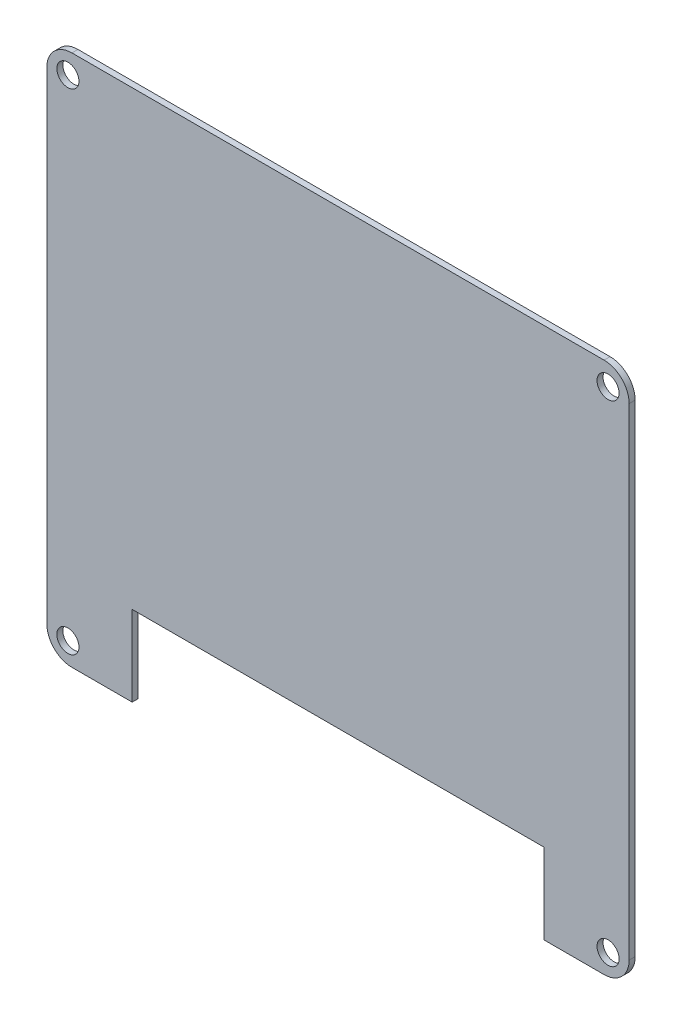
ISO-10303-21;
HEADER;
FILE_DESCRIPTION(('STEP AP214'),'2;1');
FILE_NAME('part.step','',(''),(''),'','','');
FILE_SCHEMA(('AUTOMOTIVE_DESIGN { 1 0 10303 214 1 1 1 1 }'));
ENDSEC;
DATA;
#1=APPLICATION_CONTEXT('core data for automotive mechanical design processes');
#2=APPLICATION_PROTOCOL_DEFINITION('international standard','automotive_design',2000,#1);
#3=PRODUCT_CONTEXT('',#1,'mechanical');
#4=PRODUCT('Part','Part','',(#3));
#5=PRODUCT_RELATED_PRODUCT_CATEGORY('part','',(#4));
#6=PRODUCT_DEFINITION_FORMATION('','',#4);
#7=PRODUCT_DEFINITION_CONTEXT('part definition',#1,'design');
#8=PRODUCT_DEFINITION('design','',#6,#7);
#9=PRODUCT_DEFINITION_SHAPE('','',#8);
#10=(LENGTH_UNIT() NAMED_UNIT(*) SI_UNIT(.MILLI.,.METRE.));
#11=(NAMED_UNIT(*) PLANE_ANGLE_UNIT() SI_UNIT($,.RADIAN.));
#12=(NAMED_UNIT(*) SI_UNIT($,.STERADIAN.) SOLID_ANGLE_UNIT());
#13=UNCERTAINTY_MEASURE_WITH_UNIT(LENGTH_MEASURE(1.E-05),#10,'distance_accuracy_value','');
#14=(GEOMETRIC_REPRESENTATION_CONTEXT(3) GLOBAL_UNCERTAINTY_ASSIGNED_CONTEXT((#13)) GLOBAL_UNIT_ASSIGNED_CONTEXT((#10,
#11,#12)) REPRESENTATION_CONTEXT('',''));
#15=CARTESIAN_POINT('',(0.,0.,0.));
#16=DIRECTION('',(0.,0.,1.));
#17=DIRECTION('',(1.,0.,0.));
#18=AXIS2_PLACEMENT_3D('',#15,#16,#17);
#19=CARTESIAN_POINT('',(-26.5,-24.,0.6));
#20=DIRECTION('',(0.,0.,-1.));
#21=DIRECTION('',(-1.,0.,0.));
#22=AXIS2_PLACEMENT_3D('',#19,#20,#21);
#23=PLANE('',#22);
#24=CARTESIAN_POINT('',(-26.5,-24.,0.6));
#25=DIRECTION('',(0.,0.,1.));
#26=DIRECTION('',(-1.,0.,0.));
#27=AXIS2_PLACEMENT_3D('',#24,#25,#26);
#28=CIRCLE('',#27,2.5);
#29=CARTESIAN_POINT('',(-29.,-24.,0.6));
#30=VERTEX_POINT('',#29);
#31=CARTESIAN_POINT('',(-26.5,-26.5,0.6));
#32=VERTEX_POINT('',#31);
#33=EDGE_CURVE('E179',#30,#32,#28,.T.);
#34=ORIENTED_EDGE('',*,*,#33,.T.);
#35=DIRECTION('',(1.,0.,0.));
#36=VECTOR('',#35,1.);
#37=CARTESIAN_POINT('',(-26.5,-26.5,0.6));
#38=LINE('',#37,#36);
#39=CARTESIAN_POINT('',(-20.5,-26.5,0.6));
#40=VERTEX_POINT('',#39);
#41=EDGE_CURVE('E107',#32,#40,#38,.T.);
#42=ORIENTED_EDGE('',*,*,#41,.T.);
#43=DIRECTION('',(0.,1.,0.));
#44=VECTOR('',#43,1.);
#45=CARTESIAN_POINT('',(-20.5,-26.5,0.6));
#46=LINE('',#45,#44);
#47=CARTESIAN_POINT('',(-20.5,-18.5,0.6));
#48=VERTEX_POINT('',#47);
#49=EDGE_CURVE('E206',#40,#48,#46,.T.);
#50=ORIENTED_EDGE('',*,*,#49,.T.);
#51=DIRECTION('',(1.,0.,0.));
#52=VECTOR('',#51,1.);
#53=CARTESIAN_POINT('',(-20.5,-18.5,0.6));
#54=LINE('',#53,#52);
#55=CARTESIAN_POINT('',(20.5,-18.5,0.6));
#56=VERTEX_POINT('',#55);
#57=EDGE_CURVE('E225',#48,#56,#54,.T.);
#58=ORIENTED_EDGE('',*,*,#57,.T.);
#59=DIRECTION('',(0.,-1.,0.));
#60=VECTOR('',#59,1.);
#61=CARTESIAN_POINT('',(20.5,-18.5,0.6));
#62=LINE('',#61,#60);
#63=CARTESIAN_POINT('',(20.5,-26.5,0.6));
#64=VERTEX_POINT('',#63);
#65=EDGE_CURVE('E222',#56,#64,#62,.T.);
#66=ORIENTED_EDGE('',*,*,#65,.T.);
#67=DIRECTION('',(1.,0.,0.));
#68=VECTOR('',#67,1.);
#69=CARTESIAN_POINT('',(20.5,-26.5,0.6));
#70=LINE('',#69,#68);
#71=CARTESIAN_POINT('',(26.5,-26.5,0.6));
#72=VERTEX_POINT('',#71);
#73=EDGE_CURVE('E224',#64,#72,#70,.T.);
#74=ORIENTED_EDGE('',*,*,#73,.T.);
#75=CARTESIAN_POINT('',(26.5,-24.,0.6));
#76=DIRECTION('',(0.,0.,1.));
#77=DIRECTION('',(1.,0.,0.));
#78=AXIS2_PLACEMENT_3D('',#75,#76,#77);
#79=CIRCLE('',#78,2.5);
#80=CARTESIAN_POINT('',(29.,-24.,0.6));
#81=VERTEX_POINT('',#80);
#82=EDGE_CURVE('E227',#72,#81,#79,.T.);
#83=ORIENTED_EDGE('',*,*,#82,.T.);
#84=DIRECTION('',(0.,1.,0.));
#85=VECTOR('',#84,1.);
#86=CARTESIAN_POINT('',(29.,-24.,0.6));
#87=LINE('',#86,#85);
#88=CARTESIAN_POINT('',(29.,24.,0.6));
#89=VERTEX_POINT('',#88);
#90=EDGE_CURVE('E233',#81,#89,#87,.T.);
#91=ORIENTED_EDGE('',*,*,#90,.T.);
#92=CARTESIAN_POINT('',(26.5,24.,0.6));
#93=DIRECTION('',(0.,0.,1.));
#94=DIRECTION('',(-1.,0.,0.));
#95=AXIS2_PLACEMENT_3D('',#92,#93,#94);
#96=CIRCLE('',#95,2.5);
#97=CARTESIAN_POINT('',(26.5,26.5,0.6));
#98=VERTEX_POINT('',#97);
#99=EDGE_CURVE('E138',#89,#98,#96,.T.);
#100=ORIENTED_EDGE('',*,*,#99,.T.);
#101=DIRECTION('',(-1.,0.,0.));
#102=VECTOR('',#101,1.);
#103=CARTESIAN_POINT('',(-26.5,26.5,0.6));
#104=LINE('',#103,#102);
#105=CARTESIAN_POINT('',(-26.5,26.5,0.6));
#106=VERTEX_POINT('',#105);
#107=EDGE_CURVE('E132',#98,#106,#104,.T.);
#108=ORIENTED_EDGE('',*,*,#107,.T.);
#109=CARTESIAN_POINT('',(-26.5,24.,0.6));
#110=DIRECTION('',(0.,0.,1.));
#111=DIRECTION('',(-1.,0.,0.));
#112=AXIS2_PLACEMENT_3D('',#109,#110,#111);
#113=CIRCLE('',#112,2.5);
#114=CARTESIAN_POINT('',(-29.,24.,0.6));
#115=VERTEX_POINT('',#114);
#116=EDGE_CURVE('E136',#106,#115,#113,.T.);
#117=ORIENTED_EDGE('',*,*,#116,.T.);
#118=DIRECTION('',(0.,-1.,0.));
#119=VECTOR('',#118,1.);
#120=CARTESIAN_POINT('',(-29.,-24.,0.6));
#121=LINE('',#120,#119);
#122=EDGE_CURVE('E52',#115,#30,#121,.T.);
#123=ORIENTED_EDGE('',*,*,#122,.T.);
#124=EDGE_LOOP('',(#34,#42,#50,#58,#66,#74,#83,#91,#100,#108,#117,#123));
#125=FACE_BOUND('',#124,.T.);
#126=CARTESIAN_POINT('',(-26.9,24.4,0.6));
#127=DIRECTION('',(0.,0.,1.));
#128=DIRECTION('',(1.,0.,0.));
#129=AXIS2_PLACEMENT_3D('',#126,#127,#128);
#130=CIRCLE('',#129,1.1);
#131=CARTESIAN_POINT('',(-25.8,24.4,0.6));
#132=VERTEX_POINT('',#131);
#133=EDGE_CURVE('E160',#132,#132,#130,.T.);
#134=ORIENTED_EDGE('',*,*,#133,.F.);
#135=EDGE_LOOP('',(#134));
#136=FACE_BOUND('',#135,.T.);
#137=CARTESIAN_POINT('',(-26.9,-24.4,0.6));
#138=DIRECTION('',(0.,0.,1.));
#139=DIRECTION('',(-1.,0.,0.));
#140=AXIS2_PLACEMENT_3D('',#137,#138,#139);
#141=CIRCLE('',#140,1.1);
#142=CARTESIAN_POINT('',(-28.,-24.4,0.6));
#143=VERTEX_POINT('',#142);
#144=EDGE_CURVE('E297',#143,#143,#141,.T.);
#145=ORIENTED_EDGE('',*,*,#144,.F.);
#146=EDGE_LOOP('',(#145));
#147=FACE_BOUND('',#146,.T.);
#148=CARTESIAN_POINT('',(26.9,-24.4,0.6));
#149=DIRECTION('',(0.,0.,1.));
#150=DIRECTION('',(1.,0.,0.));
#151=AXIS2_PLACEMENT_3D('',#148,#149,#150);
#152=CIRCLE('',#151,1.09999999999999);
#153=CARTESIAN_POINT('',(28.,-24.4,0.6));
#154=VERTEX_POINT('',#153);
#155=EDGE_CURVE('E291',#154,#154,#152,.T.);
#156=ORIENTED_EDGE('',*,*,#155,.F.);
#157=EDGE_LOOP('',(#156));
#158=FACE_BOUND('',#157,.T.);
#159=CARTESIAN_POINT('',(26.9,24.4,0.6));
#160=DIRECTION('',(0.,0.,1.));
#161=DIRECTION('',(-1.,0.,0.));
#162=AXIS2_PLACEMENT_3D('',#159,#160,#161);
#163=CIRCLE('',#162,1.1);
#164=CARTESIAN_POINT('',(25.8,24.4,0.6));
#165=VERTEX_POINT('',#164);
#166=EDGE_CURVE('E282',#165,#165,#163,.T.);
#167=ORIENTED_EDGE('',*,*,#166,.F.);
#168=EDGE_LOOP('',(#167));
#169=FACE_BOUND('',#168,.T.);
#170=ADVANCED_FACE('F35',(#125,#136,#147,#158,#169),#23,.F.);
#171=CARTESIAN_POINT('',(-26.5,-24.,0.));
#172=DIRECTION('',(0.,0.,-1.));
#173=DIRECTION('',(-1.,0.,0.));
#174=AXIS2_PLACEMENT_3D('',#171,#172,#173);
#175=PLANE('',#174);
#176=CARTESIAN_POINT('',(26.9,-24.4,0.));
#177=DIRECTION('',(0.,0.,1.));
#178=DIRECTION('',(1.,0.,0.));
#179=AXIS2_PLACEMENT_3D('',#176,#177,#178);
#180=CIRCLE('',#179,1.09999999999999);
#181=CARTESIAN_POINT('',(28.,-24.4,0.));
#182=VERTEX_POINT('',#181);
#183=EDGE_CURVE('E288',#182,#182,#180,.T.);
#184=ORIENTED_EDGE('',*,*,#183,.T.);
#185=EDGE_LOOP('',(#184));
#186=FACE_BOUND('',#185,.T.);
#187=CARTESIAN_POINT('',(-26.9,24.4,0.));
#188=DIRECTION('',(0.,0.,1.));
#189=DIRECTION('',(1.,0.,0.));
#190=AXIS2_PLACEMENT_3D('',#187,#188,#189);
#191=CIRCLE('',#190,1.1);
#192=CARTESIAN_POINT('',(-25.8,24.4,0.));
#193=VERTEX_POINT('',#192);
#194=EDGE_CURVE('E300',#193,#193,#191,.T.);
#195=ORIENTED_EDGE('',*,*,#194,.T.);
#196=EDGE_LOOP('',(#195));
#197=FACE_BOUND('',#196,.T.);
#198=CARTESIAN_POINT('',(-26.5,-24.,0.));
#199=DIRECTION('',(0.,0.,1.));
#200=DIRECTION('',(-1.,0.,0.));
#201=AXIS2_PLACEMENT_3D('',#198,#199,#200);
#202=CIRCLE('',#201,2.5);
#203=CARTESIAN_POINT('',(-29.,-24.,0.));
#204=VERTEX_POINT('',#203);
#205=CARTESIAN_POINT('',(-26.5,-26.5,0.));
#206=VERTEX_POINT('',#205);
#207=EDGE_CURVE('E156',#204,#206,#202,.T.);
#208=ORIENTED_EDGE('',*,*,#207,.F.);
#209=DIRECTION('',(0.,-1.,0.));
#210=VECTOR('',#209,1.);
#211=CARTESIAN_POINT('',(-29.,-24.,0.));
#212=LINE('',#211,#210);
#213=CARTESIAN_POINT('',(-29.,24.,0.));
#214=VERTEX_POINT('',#213);
#215=EDGE_CURVE('E99',#214,#204,#212,.T.);
#216=ORIENTED_EDGE('',*,*,#215,.F.);
#217=CARTESIAN_POINT('',(-26.5,24.,0.));
#218=DIRECTION('',(0.,0.,1.));
#219=DIRECTION('',(-1.,0.,0.));
#220=AXIS2_PLACEMENT_3D('',#217,#218,#219);
#221=CIRCLE('',#220,2.5);
#222=CARTESIAN_POINT('',(-26.5,26.5,0.));
#223=VERTEX_POINT('',#222);
#224=EDGE_CURVE('E93',#223,#214,#221,.T.);
#225=ORIENTED_EDGE('',*,*,#224,.F.);
#226=DIRECTION('',(-1.,0.,0.));
#227=VECTOR('',#226,1.);
#228=CARTESIAN_POINT('',(-26.5,26.5,0.));
#229=LINE('',#228,#227);
#230=CARTESIAN_POINT('',(26.5,26.5,0.));
#231=VERTEX_POINT('',#230);
#232=EDGE_CURVE('E146',#231,#223,#229,.T.);
#233=ORIENTED_EDGE('',*,*,#232,.F.);
#234=CARTESIAN_POINT('',(26.5,24.,0.));
#235=DIRECTION('',(0.,0.,1.));
#236=DIRECTION('',(-1.,0.,0.));
#237=AXIS2_PLACEMENT_3D('',#234,#235,#236);
#238=CIRCLE('',#237,2.5);
#239=CARTESIAN_POINT('',(29.,24.,0.));
#240=VERTEX_POINT('',#239);
#241=EDGE_CURVE('E174',#240,#231,#238,.T.);
#242=ORIENTED_EDGE('',*,*,#241,.F.);
#243=DIRECTION('',(0.,1.,0.));
#244=VECTOR('',#243,1.);
#245=CARTESIAN_POINT('',(29.,-24.,0.));
#246=LINE('',#245,#244);
#247=CARTESIAN_POINT('',(29.,-24.,0.));
#248=VERTEX_POINT('',#247);
#249=EDGE_CURVE('E172',#248,#240,#246,.T.);
#250=ORIENTED_EDGE('',*,*,#249,.F.);
#251=CARTESIAN_POINT('',(26.5,-24.,0.));
#252=DIRECTION('',(0.,0.,1.));
#253=DIRECTION('',(1.,0.,0.));
#254=AXIS2_PLACEMENT_3D('',#251,#252,#253);
#255=CIRCLE('',#254,2.5);
#256=CARTESIAN_POINT('',(26.5,-26.5,0.));
#257=VERTEX_POINT('',#256);
#258=EDGE_CURVE('E170',#257,#248,#255,.T.);
#259=ORIENTED_EDGE('',*,*,#258,.F.);
#260=DIRECTION('',(1.,0.,0.));
#261=VECTOR('',#260,1.);
#262=CARTESIAN_POINT('',(20.5,-26.5,0.));
#263=LINE('',#262,#261);
#264=CARTESIAN_POINT('',(20.5,-26.5,0.));
#265=VERTEX_POINT('',#264);
#266=EDGE_CURVE('E168',#265,#257,#263,.T.);
#267=ORIENTED_EDGE('',*,*,#266,.F.);
#268=DIRECTION('',(0.,-1.,0.));
#269=VECTOR('',#268,1.);
#270=CARTESIAN_POINT('',(20.5,-18.5,0.));
#271=LINE('',#270,#269);
#272=CARTESIAN_POINT('',(20.5,-18.5,0.));
#273=VERTEX_POINT('',#272);
#274=EDGE_CURVE('E166',#273,#265,#271,.T.);
#275=ORIENTED_EDGE('',*,*,#274,.F.);
#276=DIRECTION('',(1.,0.,0.));
#277=VECTOR('',#276,1.);
#278=CARTESIAN_POINT('',(-20.5,-18.5,0.));
#279=LINE('',#278,#277);
#280=CARTESIAN_POINT('',(-20.5,-18.5,0.));
#281=VERTEX_POINT('',#280);
#282=EDGE_CURVE('E164',#281,#273,#279,.T.);
#283=ORIENTED_EDGE('',*,*,#282,.F.);
#284=DIRECTION('',(0.,1.,0.));
#285=VECTOR('',#284,1.);
#286=CARTESIAN_POINT('',(-20.5,-26.5,0.));
#287=LINE('',#286,#285);
#288=CARTESIAN_POINT('',(-20.5,-26.5,0.));
#289=VERTEX_POINT('',#288);
#290=EDGE_CURVE('E162',#289,#281,#287,.T.);
#291=ORIENTED_EDGE('',*,*,#290,.F.);
#292=DIRECTION('',(1.,0.,0.));
#293=VECTOR('',#292,1.);
#294=CARTESIAN_POINT('',(-26.5,-26.5,0.));
#295=LINE('',#294,#293);
#296=EDGE_CURVE('E159',#206,#289,#295,.T.);
#297=ORIENTED_EDGE('',*,*,#296,.F.);
#298=EDGE_LOOP('',(#208,#216,#225,#233,#242,#250,#259,#267,#275,#283,#291,#297));
#299=FACE_BOUND('',#298,.T.);
#300=CARTESIAN_POINT('',(-26.9,-24.4,0.));
#301=DIRECTION('',(0.,0.,1.));
#302=DIRECTION('',(-1.,0.,0.));
#303=AXIS2_PLACEMENT_3D('',#300,#301,#302);
#304=CIRCLE('',#303,1.1);
#305=CARTESIAN_POINT('',(-28.,-24.4,0.));
#306=VERTEX_POINT('',#305);
#307=EDGE_CURVE('E294',#306,#306,#304,.T.);
#308=ORIENTED_EDGE('',*,*,#307,.T.);
#309=EDGE_LOOP('',(#308));
#310=FACE_BOUND('',#309,.T.);
#311=CARTESIAN_POINT('',(26.9,24.4,0.));
#312=DIRECTION('',(0.,0.,1.));
#313=DIRECTION('',(-1.,0.,0.));
#314=AXIS2_PLACEMENT_3D('',#311,#312,#313);
#315=CIRCLE('',#314,1.1);
#316=CARTESIAN_POINT('',(25.8,24.4,0.));
#317=VERTEX_POINT('',#316);
#318=EDGE_CURVE('E285',#317,#317,#315,.T.);
#319=ORIENTED_EDGE('',*,*,#318,.T.);
#320=EDGE_LOOP('',(#319));
#321=FACE_BOUND('',#320,.T.);
#322=ADVANCED_FACE('F210',(#186,#197,#299,#310,#321),#175,.T.);
#323=CARTESIAN_POINT('',(-26.5,-24.,0.6));
#324=DIRECTION('',(0.,0.,-1.));
#325=DIRECTION('',(-1.,0.,0.));
#326=AXIS2_PLACEMENT_3D('',#323,#324,#325);
#327=CYLINDRICAL_SURFACE('',#326,2.5);
#328=ORIENTED_EDGE('',*,*,#207,.T.);
#329=DIRECTION('',(0.,0.,-1.));
#330=VECTOR('',#329,1.);
#331=CARTESIAN_POINT('',(-26.5,-26.5,0.6));
#332=LINE('',#331,#330);
#333=EDGE_CURVE('E11',#32,#206,#332,.T.);
#334=ORIENTED_EDGE('',*,*,#333,.F.);
#335=ORIENTED_EDGE('',*,*,#33,.F.);
#336=DIRECTION('',(0.,0.,-1.));
#337=VECTOR('',#336,1.);
#338=CARTESIAN_POINT('',(-29.,-24.,0.6));
#339=LINE('',#338,#337);
#340=EDGE_CURVE('E152',#30,#204,#339,.T.);
#341=ORIENTED_EDGE('',*,*,#340,.T.);
#342=EDGE_LOOP('',(#328,#334,#335,#341));
#343=FACE_BOUND('',#342,.T.);
#344=ADVANCED_FACE('F37',(#343),#327,.T.);
#345=CARTESIAN_POINT('',(-26.5,-26.5,0.6));
#346=DIRECTION('',(0.,1.,0.));
#347=DIRECTION('',(0.,0.,1.));
#348=AXIS2_PLACEMENT_3D('',#345,#346,#347);
#349=PLANE('',#348);
#350=ORIENTED_EDGE('',*,*,#296,.T.);
#351=DIRECTION('',(0.,0.,-1.));
#352=VECTOR('',#351,1.);
#353=CARTESIAN_POINT('',(-20.5,-26.5,0.6));
#354=LINE('',#353,#352);
#355=EDGE_CURVE('E44',#40,#289,#354,.T.);
#356=ORIENTED_EDGE('',*,*,#355,.F.);
#357=ORIENTED_EDGE('',*,*,#41,.F.);
#358=ORIENTED_EDGE('',*,*,#333,.T.);
#359=EDGE_LOOP('',(#350,#356,#357,#358));
#360=FACE_BOUND('',#359,.T.);
#361=ADVANCED_FACE('F412',(#360),#349,.F.);
#362=CARTESIAN_POINT('',(-20.5,-26.5,0.6));
#363=DIRECTION('',(-1.,0.,0.));
#364=DIRECTION('',(0.,0.,1.));
#365=AXIS2_PLACEMENT_3D('',#362,#363,#364);
#366=PLANE('',#365);
#367=ORIENTED_EDGE('',*,*,#290,.T.);
#368=DIRECTION('',(0.,0.,-1.));
#369=VECTOR('',#368,1.);
#370=CARTESIAN_POINT('',(-20.5,-18.5,0.6));
#371=LINE('',#370,#369);
#372=EDGE_CURVE('E198',#48,#281,#371,.T.);
#373=ORIENTED_EDGE('',*,*,#372,.F.);
#374=ORIENTED_EDGE('',*,*,#49,.F.);
#375=ORIENTED_EDGE('',*,*,#355,.T.);
#376=EDGE_LOOP('',(#367,#373,#374,#375));
#377=FACE_BOUND('',#376,.T.);
#378=ADVANCED_FACE('F204',(#377),#366,.F.);
#379=CARTESIAN_POINT('',(-20.5,-18.5,0.6));
#380=DIRECTION('',(0.,1.,0.));
#381=DIRECTION('',(0.,0.,1.));
#382=AXIS2_PLACEMENT_3D('',#379,#380,#381);
#383=PLANE('',#382);
#384=ORIENTED_EDGE('',*,*,#282,.T.);
#385=DIRECTION('',(0.,0.,-1.));
#386=VECTOR('',#385,1.);
#387=CARTESIAN_POINT('',(20.5,-18.5,0.6));
#388=LINE('',#387,#386);
#389=EDGE_CURVE('E195',#56,#273,#388,.T.);
#390=ORIENTED_EDGE('',*,*,#389,.F.);
#391=ORIENTED_EDGE('',*,*,#57,.F.);
#392=ORIENTED_EDGE('',*,*,#372,.T.);
#393=EDGE_LOOP('',(#384,#390,#391,#392));
#394=FACE_BOUND('',#393,.T.);
#395=ADVANCED_FACE('F216',(#394),#383,.F.);
#396=CARTESIAN_POINT('',(20.5,-18.5,0.6));
#397=DIRECTION('',(1.,0.,0.));
#398=DIRECTION('',(0.,0.,-1.));
#399=AXIS2_PLACEMENT_3D('',#396,#397,#398);
#400=PLANE('',#399);
#401=ORIENTED_EDGE('',*,*,#274,.T.);
#402=DIRECTION('',(0.,0.,-1.));
#403=VECTOR('',#402,1.);
#404=CARTESIAN_POINT('',(20.5,-26.5,0.6));
#405=LINE('',#404,#403);
#406=EDGE_CURVE('E192',#64,#265,#405,.T.);
#407=ORIENTED_EDGE('',*,*,#406,.F.);
#408=ORIENTED_EDGE('',*,*,#65,.F.);
#409=ORIENTED_EDGE('',*,*,#389,.T.);
#410=EDGE_LOOP('',(#401,#407,#408,#409));
#411=FACE_BOUND('',#410,.T.);
#412=ADVANCED_FACE('F220',(#411),#400,.F.);
#413=CARTESIAN_POINT('',(20.5,-26.5,0.6));
#414=DIRECTION('',(0.,1.,0.));
#415=DIRECTION('',(0.,0.,1.));
#416=AXIS2_PLACEMENT_3D('',#413,#414,#415);
#417=PLANE('',#416);
#418=ORIENTED_EDGE('',*,*,#266,.T.);
#419=DIRECTION('',(0.,0.,-1.));
#420=VECTOR('',#419,1.);
#421=CARTESIAN_POINT('',(26.5,-26.5,0.6));
#422=LINE('',#421,#420);
#423=EDGE_CURVE('E189',#72,#257,#422,.T.);
#424=ORIENTED_EDGE('',*,*,#423,.F.);
#425=ORIENTED_EDGE('',*,*,#73,.F.);
#426=ORIENTED_EDGE('',*,*,#406,.T.);
#427=EDGE_LOOP('',(#418,#424,#425,#426));
#428=FACE_BOUND('',#427,.T.);
#429=ADVANCED_FACE('F377',(#428),#417,.F.);
#430=CARTESIAN_POINT('',(26.5,-24.,0.6));
#431=DIRECTION('',(0.,0.,-1.));
#432=DIRECTION('',(-1.,0.,0.));
#433=AXIS2_PLACEMENT_3D('',#430,#431,#432);
#434=CYLINDRICAL_SURFACE('',#433,2.5);
#435=ORIENTED_EDGE('',*,*,#258,.T.);
#436=DIRECTION('',(0.,0.,-1.));
#437=VECTOR('',#436,1.);
#438=CARTESIAN_POINT('',(29.,-24.,0.6));
#439=LINE('',#438,#437);
#440=EDGE_CURVE('E186',#81,#248,#439,.T.);
#441=ORIENTED_EDGE('',*,*,#440,.F.);
#442=ORIENTED_EDGE('',*,*,#82,.F.);
#443=ORIENTED_EDGE('',*,*,#423,.T.);
#444=EDGE_LOOP('',(#435,#441,#442,#443));
#445=FACE_BOUND('',#444,.T.);
#446=ADVANCED_FACE('F368',(#445),#434,.T.);
#447=CARTESIAN_POINT('',(29.,-24.,0.6));
#448=DIRECTION('',(-1.,0.,0.));
#449=DIRECTION('',(0.,0.,1.));
#450=AXIS2_PLACEMENT_3D('',#447,#448,#449);
#451=PLANE('',#450);
#452=ORIENTED_EDGE('',*,*,#249,.T.);
#453=DIRECTION('',(0.,0.,-1.));
#454=VECTOR('',#453,1.);
#455=CARTESIAN_POINT('',(29.,24.,0.6));
#456=LINE('',#455,#454);
#457=EDGE_CURVE('E183',#89,#240,#456,.T.);
#458=ORIENTED_EDGE('',*,*,#457,.F.);
#459=ORIENTED_EDGE('',*,*,#90,.F.);
#460=ORIENTED_EDGE('',*,*,#440,.T.);
#461=EDGE_LOOP('',(#452,#458,#459,#460));
#462=FACE_BOUND('',#461,.T.);
#463=ADVANCED_FACE('F239',(#462),#451,.F.);
#464=CARTESIAN_POINT('',(26.5,24.,0.6));
#465=DIRECTION('',(0.,0.,-1.));
#466=DIRECTION('',(-1.,0.,0.));
#467=AXIS2_PLACEMENT_3D('',#464,#465,#466);
#468=CYLINDRICAL_SURFACE('',#467,2.5);
#469=ORIENTED_EDGE('',*,*,#241,.T.);
#470=DIRECTION('',(0.,0.,-1.));
#471=VECTOR('',#470,1.);
#472=CARTESIAN_POINT('',(26.5,26.5,0.6));
#473=LINE('',#472,#471);
#474=EDGE_CURVE('E147',#98,#231,#473,.T.);
#475=ORIENTED_EDGE('',*,*,#474,.F.);
#476=ORIENTED_EDGE('',*,*,#99,.F.);
#477=ORIENTED_EDGE('',*,*,#457,.T.);
#478=EDGE_LOOP('',(#469,#475,#476,#477));
#479=FACE_BOUND('',#478,.T.);
#480=ADVANCED_FACE('F243',(#479),#468,.T.);
#481=CARTESIAN_POINT('',(-26.5,26.5,0.6));
#482=DIRECTION('',(0.,-1.,0.));
#483=DIRECTION('',(0.,0.,-1.));
#484=AXIS2_PLACEMENT_3D('',#481,#482,#483);
#485=PLANE('',#484);
#486=ORIENTED_EDGE('',*,*,#232,.T.);
#487=DIRECTION('',(0.,0.,-1.));
#488=VECTOR('',#487,1.);
#489=CARTESIAN_POINT('',(-26.5,26.5,0.6));
#490=LINE('',#489,#488);
#491=EDGE_CURVE('E143',#106,#223,#490,.T.);
#492=ORIENTED_EDGE('',*,*,#491,.F.);
#493=ORIENTED_EDGE('',*,*,#107,.F.);
#494=ORIENTED_EDGE('',*,*,#474,.T.);
#495=EDGE_LOOP('',(#486,#492,#493,#494));
#496=FACE_BOUND('',#495,.T.);
#497=ADVANCED_FACE('F144',(#496),#485,.F.);
#498=CARTESIAN_POINT('',(-26.5,24.,0.6));
#499=DIRECTION('',(0.,0.,-1.));
#500=DIRECTION('',(-1.,0.,0.));
#501=AXIS2_PLACEMENT_3D('',#498,#499,#500);
#502=CYLINDRICAL_SURFACE('',#501,2.5);
#503=ORIENTED_EDGE('',*,*,#224,.T.);
#504=DIRECTION('',(0.,0.,-1.));
#505=VECTOR('',#504,1.);
#506=CARTESIAN_POINT('',(-29.,24.,0.6));
#507=LINE('',#506,#505);
#508=EDGE_CURVE('E148',#115,#214,#507,.T.);
#509=ORIENTED_EDGE('',*,*,#508,.F.);
#510=ORIENTED_EDGE('',*,*,#116,.F.);
#511=ORIENTED_EDGE('',*,*,#491,.T.);
#512=EDGE_LOOP('',(#503,#509,#510,#511));
#513=FACE_BOUND('',#512,.T.);
#514=ADVANCED_FACE('F150',(#513),#502,.T.);
#515=CARTESIAN_POINT('',(-29.,-24.,0.6));
#516=DIRECTION('',(1.,0.,0.));
#517=DIRECTION('',(0.,0.,-1.));
#518=AXIS2_PLACEMENT_3D('',#515,#516,#517);
#519=PLANE('',#518);
#520=ORIENTED_EDGE('',*,*,#215,.T.);
#521=ORIENTED_EDGE('',*,*,#340,.F.);
#522=ORIENTED_EDGE('',*,*,#122,.F.);
#523=ORIENTED_EDGE('',*,*,#508,.T.);
#524=EDGE_LOOP('',(#520,#521,#522,#523));
#525=FACE_BOUND('',#524,.T.);
#526=ADVANCED_FACE('F247',(#525),#519,.F.);
#527=CARTESIAN_POINT('',(-26.9,24.4,0.6));
#528=DIRECTION('',(0.,0.,-1.));
#529=DIRECTION('',(-1.,0.,0.));
#530=AXIS2_PLACEMENT_3D('',#527,#528,#529);
#531=CYLINDRICAL_SURFACE('',#530,1.1);
#532=ORIENTED_EDGE('',*,*,#133,.T.);
#533=EDGE_LOOP('',(#532));
#534=FACE_BOUND('',#533,.T.);
#535=ORIENTED_EDGE('',*,*,#194,.F.);
#536=EDGE_LOOP('',(#535));
#537=FACE_BOUND('',#536,.T.);
#538=ADVANCED_FACE('F249',(#534,#537),#531,.F.);
#539=CARTESIAN_POINT('',(-26.9,-24.4,0.6));
#540=DIRECTION('',(0.,0.,-1.));
#541=DIRECTION('',(-1.,0.,0.));
#542=AXIS2_PLACEMENT_3D('',#539,#540,#541);
#543=CYLINDRICAL_SURFACE('',#542,1.1);
#544=ORIENTED_EDGE('',*,*,#144,.T.);
#545=EDGE_LOOP('',(#544));
#546=FACE_BOUND('',#545,.T.);
#547=ORIENTED_EDGE('',*,*,#307,.F.);
#548=EDGE_LOOP('',(#547));
#549=FACE_BOUND('',#548,.T.);
#550=ADVANCED_FACE('F255',(#546,#549),#543,.F.);
#551=CARTESIAN_POINT('',(26.9,-24.4,0.6));
#552=DIRECTION('',(0.,0.,-1.));
#553=DIRECTION('',(-1.,0.,0.));
#554=AXIS2_PLACEMENT_3D('',#551,#552,#553);
#555=CYLINDRICAL_SURFACE('',#554,1.09999999999999);
#556=ORIENTED_EDGE('',*,*,#155,.T.);
#557=EDGE_LOOP('',(#556));
#558=FACE_BOUND('',#557,.T.);
#559=ORIENTED_EDGE('',*,*,#183,.F.);
#560=EDGE_LOOP('',(#559));
#561=FACE_BOUND('',#560,.T.);
#562=ADVANCED_FACE('F269',(#558,#561),#555,.F.);
#563=CARTESIAN_POINT('',(26.9,24.4,0.6));
#564=DIRECTION('',(0.,0.,-1.));
#565=DIRECTION('',(-1.,0.,0.));
#566=AXIS2_PLACEMENT_3D('',#563,#564,#565);
#567=CYLINDRICAL_SURFACE('',#566,1.1);
#568=ORIENTED_EDGE('',*,*,#166,.T.);
#569=EDGE_LOOP('',(#568));
#570=FACE_BOUND('',#569,.T.);
#571=ORIENTED_EDGE('',*,*,#318,.F.);
#572=EDGE_LOOP('',(#571));
#573=FACE_BOUND('',#572,.T.);
#574=ADVANCED_FACE('F273',(#570,#573),#567,.F.);
#575=CLOSED_SHELL('',(#170,#322,#344,#361,#378,#395,#412,#429,#446,#463,#480,#497,#514,#526,
#538,#550,#562,#574));
#576=MANIFOLD_SOLID_BREP('B2',#575);
#577=ADVANCED_BREP_SHAPE_REPRESENTATION('',(#18,#576),#14);
#578=SHAPE_DEFINITION_REPRESENTATION(#9,#577);
ENDSEC;
END-ISO-10303-21;
